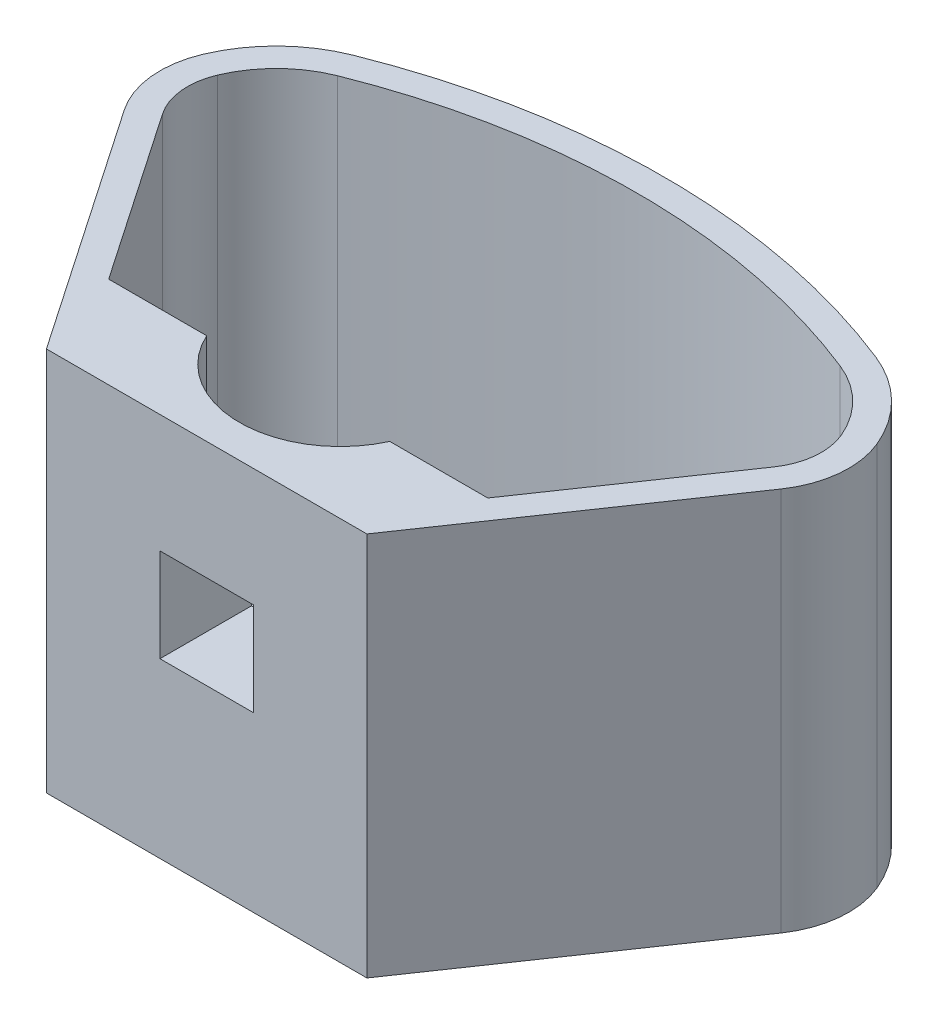
ISO-10303-21;
HEADER;
FILE_DESCRIPTION(('STEP AP214'),'2;1');
FILE_NAME('part.step','',(''),(''),'','','');
FILE_SCHEMA(('AUTOMOTIVE_DESIGN { 1 0 10303 214 1 1 1 1 }'));
ENDSEC;
DATA;
#1=APPLICATION_CONTEXT('core data for automotive mechanical design processes');
#2=APPLICATION_PROTOCOL_DEFINITION('international standard','automotive_design',2000,#1);
#3=PRODUCT_CONTEXT('',#1,'mechanical');
#4=PRODUCT('Part','Part','',(#3));
#5=PRODUCT_RELATED_PRODUCT_CATEGORY('part','',(#4));
#6=PRODUCT_DEFINITION_FORMATION('','',#4);
#7=PRODUCT_DEFINITION_CONTEXT('part definition',#1,'design');
#8=PRODUCT_DEFINITION('design','',#6,#7);
#9=PRODUCT_DEFINITION_SHAPE('','',#8);
#10=(LENGTH_UNIT() NAMED_UNIT(*) SI_UNIT(.MILLI.,.METRE.));
#11=(NAMED_UNIT(*) PLANE_ANGLE_UNIT() SI_UNIT($,.RADIAN.));
#12=(NAMED_UNIT(*) SI_UNIT($,.STERADIAN.) SOLID_ANGLE_UNIT());
#13=UNCERTAINTY_MEASURE_WITH_UNIT(LENGTH_MEASURE(1.E-05),#10,'distance_accuracy_value','');
#14=(GEOMETRIC_REPRESENTATION_CONTEXT(3) GLOBAL_UNCERTAINTY_ASSIGNED_CONTEXT((#13)) GLOBAL_UNIT_ASSIGNED_CONTEXT((#10,
#11,#12)) REPRESENTATION_CONTEXT('',''));
#15=CARTESIAN_POINT('',(0.,0.,0.));
#16=DIRECTION('',(0.,0.,1.));
#17=DIRECTION('',(1.,0.,0.));
#18=AXIS2_PLACEMENT_3D('',#15,#16,#17);
#19=CARTESIAN_POINT('',(0.,42.,27.2));
#20=DIRECTION('',(0.,-1.,0.));
#21=DIRECTION('',(0.,0.,-1.));
#22=AXIS2_PLACEMENT_3D('',#19,#20,#21);
#23=PLANE('',#22);
#24=DIRECTION('',(0.564190505025556,0.,-0.825644641500814));
#25=VECTOR('',#24,1.);
#26=CARTESIAN_POINT('',(17.5,42.,0.));
#27=LINE('',#26,#25);
#28=CARTESIAN_POINT('',(17.5,42.,0.));
#29=VERTEX_POINT('',#28);
#30=CARTESIAN_POINT('',(35.8684387410676,42.,-26.880642060099));
#31=VERTEX_POINT('',#30);
#32=EDGE_CURVE('E300',#29,#31,#27,.T.);
#33=ORIENTED_EDGE('',*,*,#32,.T.);
#34=CARTESIAN_POINT('',(27.6119923260595,42.,-32.5225471103545));
#35=DIRECTION('',(0.,-1.,0.));
#36=DIRECTION('',(0.,0.,-1.));
#37=AXIS2_PLACEMENT_3D('',#34,#35,#36);
#38=CIRCLE('',#37,10.);
#39=CARTESIAN_POINT('',(36.8359769781785,42.,-36.384943663982));
#40=VERTEX_POINT('',#39);
#41=EDGE_CURVE('E346',#31,#40,#38,.F.);
#42=ORIENTED_EDGE('',*,*,#41,.T.);
#43=CARTESIAN_POINT('',(23.,42.,-30.5913488335408));
#44=DIRECTION('',(0.,-1.,0.));
#45=DIRECTION('',(0.,0.,-1.));
#46=AXIS2_PLACEMENT_3D('',#43,#44,#45);
#47=CIRCLE('',#46,15.);
#48=CARTESIAN_POINT('',(28.5466237942122,42.,-44.5281692917902));
#49=VERTEX_POINT('',#48);
#50=EDGE_CURVE('E333',#40,#49,#47,.F.);
#51=ORIENTED_EDGE('',*,*,#50,.T.);
#52=CARTESIAN_POINT('',(0.,42.,27.2));
#53=DIRECTION('',(0.,1.,0.));
#54=DIRECTION('',(0.,0.,-1.));
#55=AXIS2_PLACEMENT_3D('',#52,#53,#54);
#56=CIRCLE('',#55,77.2);
#57=CARTESIAN_POINT('',(-28.5466237942122,42.,-44.5281692917902));
#58=VERTEX_POINT('',#57);
#59=EDGE_CURVE('E303',#49,#58,#56,.T.);
#60=ORIENTED_EDGE('',*,*,#59,.T.);
#61=CARTESIAN_POINT('',(-23.,42.,-30.5913488335408));
#62=DIRECTION('',(0.,-1.,0.));
#63=DIRECTION('',(0.,0.,-1.));
#64=AXIS2_PLACEMENT_3D('',#61,#62,#63);
#65=CIRCLE('',#64,15.);
#66=CARTESIAN_POINT('',(-36.8359769781785,42.,-36.384943663982));
#67=VERTEX_POINT('',#66);
#68=EDGE_CURVE('E330',#58,#67,#65,.F.);
#69=ORIENTED_EDGE('',*,*,#68,.T.);
#70=CARTESIAN_POINT('',(-27.6119923260595,42.,-32.5225471103545));
#71=DIRECTION('',(0.,-1.,0.));
#72=DIRECTION('',(0.,0.,-1.));
#73=AXIS2_PLACEMENT_3D('',#70,#71,#72);
#74=CIRCLE('',#73,10.);
#75=CARTESIAN_POINT('',(-35.8684387410676,42.,-26.880642060099));
#76=VERTEX_POINT('',#75);
#77=EDGE_CURVE('E344',#67,#76,#74,.F.);
#78=ORIENTED_EDGE('',*,*,#77,.T.);
#79=DIRECTION('',(0.564190505025556,0.,0.825644641500814));
#80=VECTOR('',#79,1.);
#81=CARTESIAN_POINT('',(-38.,42.,-30.));
#82=LINE('',#81,#80);
#83=CARTESIAN_POINT('',(-17.5,42.,0.));
#84=VERTEX_POINT('',#83);
#85=EDGE_CURVE('E295',#76,#84,#82,.T.);
#86=ORIENTED_EDGE('',*,*,#85,.T.);
#87=DIRECTION('',(1.,0.,0.));
#88=VECTOR('',#87,1.);
#89=CARTESIAN_POINT('',(17.5,42.,0.));
#90=LINE('',#89,#88);
#91=EDGE_CURVE('E297',#84,#29,#90,.T.);
#92=ORIENTED_EDGE('',*,*,#91,.T.);
#93=EDGE_LOOP('',(#33,#42,#51,#60,#69,#78,#86,#92));
#94=FACE_BOUND('',#93,.T.);
#95=DIRECTION('',(-1.,0.,0.));
#96=VECTOR('',#95,1.);
#97=CARTESIAN_POINT('',(-20.6998088735285,42.,-10.));
#98=LINE('',#97,#96);
#99=CARTESIAN_POINT('',(20.6998088735285,42.,-10.));
#100=VERTEX_POINT('',#99);
#101=CARTESIAN_POINT('',(10.,42.,-10.));
#102=VERTEX_POINT('',#101);
#103=EDGE_CURVE('E233',#100,#102,#98,.T.);
#104=ORIENTED_EDGE('',*,*,#103,.T.);
#105=CARTESIAN_POINT('',(0.,42.,-14.5825756949558));
#106=DIRECTION('',(0.,1.,0.));
#107=DIRECTION('',(0.,0.,1.));
#108=AXIS2_PLACEMENT_3D('',#105,#106,#107);
#109=CIRCLE('',#108,11.);
#110=CARTESIAN_POINT('',(-10.,42.,-10.));
#111=VERTEX_POINT('',#110);
#112=EDGE_CURVE('E189',#111,#102,#109,.T.);
#113=ORIENTED_EDGE('',*,*,#112,.F.);
#114=CARTESIAN_POINT('',(-20.6998088735285,42.,-10.));
#115=VERTEX_POINT('',#114);
#116=EDGE_CURVE('E198',#111,#115,#98,.T.);
#117=ORIENTED_EDGE('',*,*,#116,.T.);
#118=DIRECTION('',(0.564190505025556,0.,0.825644641500814));
#119=VECTOR('',#118,1.);
#120=CARTESIAN_POINT('',(3.21770271829148,42.,25.0012364758341));
#121=LINE('',#120,#119);
#122=CARTESIAN_POINT('',(-33.3915048165652,42.,-28.5732135751756));
#123=VERTEX_POINT('',#122);
#124=EDGE_CURVE('E273',#123,#115,#121,.T.);
#125=ORIENTED_EDGE('',*,*,#124,.F.);
#126=CARTESIAN_POINT('',(-27.6119923260595,42.,-32.5225471103545));
#127=DIRECTION('',(0.,-1.,0.));
#128=DIRECTION('',(0.,0.,-1.));
#129=AXIS2_PLACEMENT_3D('',#126,#127,#128);
#130=CIRCLE('',#129,7.);
#131=CARTESIAN_POINT('',(-34.0687815825428,42.,-35.2262246978937));
#132=VERTEX_POINT('',#131);
#133=EDGE_CURVE('E257',#132,#123,#130,.F.);
#134=ORIENTED_EDGE('',*,*,#133,.F.);
#135=CARTESIAN_POINT('',(-23.,42.,-30.5913488335408));
#136=DIRECTION('',(0.,-1.,0.));
#137=DIRECTION('',(0.,0.,-1.));
#138=AXIS2_PLACEMENT_3D('',#135,#136,#137);
#139=CIRCLE('',#138,12.);
#140=CARTESIAN_POINT('',(-27.4372990353698,42.,-41.7408052001403));
#141=VERTEX_POINT('',#140);
#142=EDGE_CURVE('E262',#141,#132,#139,.F.);
#143=ORIENTED_EDGE('',*,*,#142,.F.);
#144=CARTESIAN_POINT('',(0.,42.,27.2));
#145=DIRECTION('',(0.,-1.,0.));
#146=DIRECTION('',(0.,0.,-1.));
#147=AXIS2_PLACEMENT_3D('',#144,#145,#146);
#148=CIRCLE('',#147,74.2);
#149=CARTESIAN_POINT('',(27.4372990353698,42.,-41.7408052001403));
#150=VERTEX_POINT('',#149);
#151=EDGE_CURVE('E278',#150,#141,#148,.F.);
#152=ORIENTED_EDGE('',*,*,#151,.F.);
#153=CARTESIAN_POINT('',(23.,42.,-30.5913488335408));
#154=DIRECTION('',(0.,-1.,0.));
#155=DIRECTION('',(0.,0.,-1.));
#156=AXIS2_PLACEMENT_3D('',#153,#154,#155);
#157=CIRCLE('',#156,12.);
#158=CARTESIAN_POINT('',(34.0687815825428,42.,-35.2262246978938));
#159=VERTEX_POINT('',#158);
#160=EDGE_CURVE('E281',#159,#150,#157,.F.);
#161=ORIENTED_EDGE('',*,*,#160,.F.);
#162=CARTESIAN_POINT('',(27.6119923260595,42.,-32.5225471103545));
#163=DIRECTION('',(0.,-1.,0.));
#164=DIRECTION('',(0.,0.,-1.));
#165=AXIS2_PLACEMENT_3D('',#162,#163,#164);
#166=CIRCLE('',#165,7.);
#167=CARTESIAN_POINT('',(33.3915048165652,42.,-28.5732135751756));
#168=VERTEX_POINT('',#167);
#169=EDGE_CURVE('E248',#168,#159,#166,.F.);
#170=ORIENTED_EDGE('',*,*,#169,.F.);
#171=DIRECTION('',(0.564190505025556,0.,-0.825644641500814));
#172=VECTOR('',#171,1.);
#173=CARTESIAN_POINT('',(-3.21770271829148,42.,25.0012364758341));
#174=LINE('',#173,#172);
#175=EDGE_CURVE('E286',#100,#168,#174,.T.);
#176=ORIENTED_EDGE('',*,*,#175,.F.);
#177=EDGE_LOOP('',(#104,#113,#117,#125,#134,#143,#152,#161,#170,#176));
#178=FACE_BOUND('',#177,.T.);
#179=ADVANCED_FACE('F34',(#94,#178),#23,.F.);
#180=CARTESIAN_POINT('',(-38.,42.,-30.));
#181=DIRECTION('',(0.825644641500814,0.,-0.564190505025556));
#182=DIRECTION('',(-0.564190505025556,0.,-0.825644641500814));
#183=AXIS2_PLACEMENT_3D('',#180,#181,#182);
#184=PLANE('',#183);
#185=ORIENTED_EDGE('',*,*,#85,.F.);
#186=DIRECTION('',(0.,1.,0.));
#187=VECTOR('',#186,1.);
#188=CARTESIAN_POINT('',(-35.8684387410676,0.,-26.880642060099));
#189=LINE('',#188,#187);
#190=CARTESIAN_POINT('',(-35.8684387410676,0.,-26.880642060099));
#191=VERTEX_POINT('',#190);
#192=EDGE_CURVE('E42',#76,#191,#189,.F.);
#193=ORIENTED_EDGE('',*,*,#192,.T.);
#194=DIRECTION('',(0.564190505025556,0.,0.825644641500814));
#195=VECTOR('',#194,1.);
#196=CARTESIAN_POINT('',(-38.,0.,-30.));
#197=LINE('',#196,#195);
#198=CARTESIAN_POINT('',(-17.5,0.,0.));
#199=VERTEX_POINT('',#198);
#200=EDGE_CURVE('E283',#191,#199,#197,.T.);
#201=ORIENTED_EDGE('',*,*,#200,.T.);
#202=DIRECTION('',(0.,-1.,0.));
#203=VECTOR('',#202,1.);
#204=CARTESIAN_POINT('',(-17.5,42.,0.));
#205=LINE('',#204,#203);
#206=EDGE_CURVE('E317',#84,#199,#205,.T.);
#207=ORIENTED_EDGE('',*,*,#206,.F.);
#208=EDGE_LOOP('',(#185,#193,#201,#207));
#209=FACE_BOUND('',#208,.T.);
#210=ADVANCED_FACE('F352',(#209),#184,.F.);
#211=CARTESIAN_POINT('',(17.5,42.,0.));
#212=DIRECTION('',(0.,0.,-1.));
#213=DIRECTION('',(-1.,0.,0.));
#214=AXIS2_PLACEMENT_3D('',#211,#212,#213);
#215=PLANE('',#214);
#216=DIRECTION('',(0.,1.,0.));
#217=VECTOR('',#216,1.);
#218=CARTESIAN_POINT('',(5.1,18.9,0.));
#219=LINE('',#218,#217);
#220=CARTESIAN_POINT('',(5.1,18.9,0.));
#221=VERTEX_POINT('',#220);
#222=CARTESIAN_POINT('',(5.1,29.1,0.));
#223=VERTEX_POINT('',#222);
#224=EDGE_CURVE('E218',#221,#223,#219,.T.);
#225=ORIENTED_EDGE('',*,*,#224,.F.);
#226=DIRECTION('',(1.,0.,0.));
#227=VECTOR('',#226,1.);
#228=CARTESIAN_POINT('',(5.1,18.9,0.));
#229=LINE('',#228,#227);
#230=CARTESIAN_POINT('',(-5.09999999999999,18.9,0.));
#231=VERTEX_POINT('',#230);
#232=EDGE_CURVE('E215',#231,#221,#229,.T.);
#233=ORIENTED_EDGE('',*,*,#232,.F.);
#234=DIRECTION('',(0.,-1.,0.));
#235=VECTOR('',#234,1.);
#236=CARTESIAN_POINT('',(-5.09999999999999,18.9,0.));
#237=LINE('',#236,#235);
#238=CARTESIAN_POINT('',(-5.09999999999999,29.1,0.));
#239=VERTEX_POINT('',#238);
#240=EDGE_CURVE('E212',#239,#231,#237,.T.);
#241=ORIENTED_EDGE('',*,*,#240,.F.);
#242=DIRECTION('',(-1.,0.,0.));
#243=VECTOR('',#242,1.);
#244=CARTESIAN_POINT('',(5.1,29.1,0.));
#245=LINE('',#244,#243);
#246=EDGE_CURVE('E56',#223,#239,#245,.T.);
#247=ORIENTED_EDGE('',*,*,#246,.F.);
#248=EDGE_LOOP('',(#225,#233,#241,#247));
#249=FACE_BOUND('',#248,.T.);
#250=DIRECTION('',(1.,0.,0.));
#251=VECTOR('',#250,1.);
#252=CARTESIAN_POINT('',(17.5,0.,0.));
#253=LINE('',#252,#251);
#254=CARTESIAN_POINT('',(17.5,0.,0.));
#255=VERTEX_POINT('',#254);
#256=EDGE_CURVE('E308',#199,#255,#253,.T.);
#257=ORIENTED_EDGE('',*,*,#256,.T.);
#258=DIRECTION('',(0.,-1.,0.));
#259=VECTOR('',#258,1.);
#260=CARTESIAN_POINT('',(17.5,42.,0.));
#261=LINE('',#260,#259);
#262=EDGE_CURVE('E306',#29,#255,#261,.T.);
#263=ORIENTED_EDGE('',*,*,#262,.F.);
#264=ORIENTED_EDGE('',*,*,#91,.F.);
#265=ORIENTED_EDGE('',*,*,#206,.T.);
#266=EDGE_LOOP('',(#257,#263,#264,#265));
#267=FACE_BOUND('',#266,.T.);
#268=ADVANCED_FACE('F364',(#249,#267),#215,.F.);
#269=CARTESIAN_POINT('',(17.5,42.,0.));
#270=DIRECTION('',(-0.825644641500814,0.,-0.564190505025556));
#271=DIRECTION('',(-0.564190505025556,0.,0.825644641500814));
#272=AXIS2_PLACEMENT_3D('',#269,#270,#271);
#273=PLANE('',#272);
#274=DIRECTION('',(0.564190505025556,0.,-0.825644641500814));
#275=VECTOR('',#274,1.);
#276=CARTESIAN_POINT('',(17.5,0.,0.));
#277=LINE('',#276,#275);
#278=CARTESIAN_POINT('',(35.8684387410676,0.,-26.880642060099));
#279=VERTEX_POINT('',#278);
#280=EDGE_CURVE('E310',#255,#279,#277,.T.);
#281=ORIENTED_EDGE('',*,*,#280,.T.);
#282=DIRECTION('',(0.,1.,0.));
#283=VECTOR('',#282,1.);
#284=CARTESIAN_POINT('',(35.8684387410676,42.,-26.880642060099));
#285=LINE('',#284,#283);
#286=EDGE_CURVE('E342',#279,#31,#285,.T.);
#287=ORIENTED_EDGE('',*,*,#286,.T.);
#288=ORIENTED_EDGE('',*,*,#32,.F.);
#289=ORIENTED_EDGE('',*,*,#262,.T.);
#290=EDGE_LOOP('',(#281,#287,#288,#289));
#291=FACE_BOUND('',#290,.T.);
#292=ADVANCED_FACE('F386',(#291),#273,.F.);
#293=CARTESIAN_POINT('',(0.,42.,27.2));
#294=DIRECTION('',(0.,-1.,0.));
#295=DIRECTION('',(0.,0.,-1.));
#296=AXIS2_PLACEMENT_3D('',#293,#294,#295);
#297=CYLINDRICAL_SURFACE('',#296,77.2);
#298=ORIENTED_EDGE('',*,*,#59,.F.);
#299=DIRECTION('',(0.,-1.,0.));
#300=VECTOR('',#299,1.);
#301=CARTESIAN_POINT('',(28.5466237942122,42.,-44.5281692917902));
#302=LINE('',#301,#300);
#303=CARTESIAN_POINT('',(28.5466237942122,0.,-44.5281692917902));
#304=VERTEX_POINT('',#303);
#305=EDGE_CURVE('E322',#49,#304,#302,.T.);
#306=ORIENTED_EDGE('',*,*,#305,.T.);
#307=CARTESIAN_POINT('',(0.,0.,27.2));
#308=DIRECTION('',(0.,1.,0.));
#309=DIRECTION('',(0.,0.,-1.));
#310=AXIS2_PLACEMENT_3D('',#307,#308,#309);
#311=CIRCLE('',#310,77.2);
#312=CARTESIAN_POINT('',(-28.5466237942122,0.,-44.5281692917902));
#313=VERTEX_POINT('',#312);
#314=EDGE_CURVE('E298',#304,#313,#311,.T.);
#315=ORIENTED_EDGE('',*,*,#314,.T.);
#316=DIRECTION('',(0.,-1.,0.));
#317=VECTOR('',#316,1.);
#318=CARTESIAN_POINT('',(-28.5466237942122,42.,-44.5281692917902));
#319=LINE('',#318,#317);
#320=EDGE_CURVE('E320',#313,#58,#319,.F.);
#321=ORIENTED_EDGE('',*,*,#320,.T.);
#322=EDGE_LOOP('',(#298,#306,#315,#321));
#323=FACE_BOUND('',#322,.T.);
#324=ADVANCED_FACE('F377',(#323),#297,.T.);
#325=CARTESIAN_POINT('',(0.,0.,27.2));
#326=DIRECTION('',(0.,-1.,0.));
#327=DIRECTION('',(0.,0.,-1.));
#328=AXIS2_PLACEMENT_3D('',#325,#326,#327);
#329=PLANE('',#328);
#330=CARTESIAN_POINT('',(23.,0.,-30.5913488335408));
#331=DIRECTION('',(0.,-1.,0.));
#332=DIRECTION('',(0.,0.,-1.));
#333=AXIS2_PLACEMENT_3D('',#330,#331,#332);
#334=CIRCLE('',#333,15.);
#335=CARTESIAN_POINT('',(36.8359769781785,0.,-36.384943663982));
#336=VERTEX_POINT('',#335);
#337=EDGE_CURVE('E327',#304,#336,#334,.T.);
#338=ORIENTED_EDGE('',*,*,#337,.T.);
#339=CARTESIAN_POINT('',(27.6119923260595,0.,-32.5225471103545));
#340=DIRECTION('',(0.,-1.,0.));
#341=DIRECTION('',(0.,0.,-1.));
#342=AXIS2_PLACEMENT_3D('',#339,#340,#341);
#343=CIRCLE('',#342,10.);
#344=EDGE_CURVE('E340',#336,#279,#343,.T.);
#345=ORIENTED_EDGE('',*,*,#344,.T.);
#346=ORIENTED_EDGE('',*,*,#280,.F.);
#347=ORIENTED_EDGE('',*,*,#256,.F.);
#348=ORIENTED_EDGE('',*,*,#200,.F.);
#349=CARTESIAN_POINT('',(-27.6119923260595,0.,-32.5225471103545));
#350=DIRECTION('',(0.,-1.,0.));
#351=DIRECTION('',(0.,0.,-1.));
#352=AXIS2_PLACEMENT_3D('',#349,#350,#351);
#353=CIRCLE('',#352,10.);
#354=CARTESIAN_POINT('',(-36.8359769781785,0.,-36.384943663982));
#355=VERTEX_POINT('',#354);
#356=EDGE_CURVE('E338',#191,#355,#353,.T.);
#357=ORIENTED_EDGE('',*,*,#356,.T.);
#358=CARTESIAN_POINT('',(-23.,0.,-30.5913488335408));
#359=DIRECTION('',(0.,-1.,0.));
#360=DIRECTION('',(0.,0.,-1.));
#361=AXIS2_PLACEMENT_3D('',#358,#359,#360);
#362=CIRCLE('',#361,15.);
#363=EDGE_CURVE('E325',#355,#313,#362,.T.);
#364=ORIENTED_EDGE('',*,*,#363,.T.);
#365=ORIENTED_EDGE('',*,*,#314,.F.);
#366=EDGE_LOOP('',(#338,#345,#346,#347,#348,#357,#364,#365));
#367=FACE_BOUND('',#366,.T.);
#368=ADVANCED_FACE('F358',(#367),#329,.T.);
#369=CARTESIAN_POINT('',(23.,42.,-30.5913488335408));
#370=DIRECTION('',(0.,-1.,0.));
#371=DIRECTION('',(0.,0.,-1.));
#372=AXIS2_PLACEMENT_3D('',#369,#370,#371);
#373=CYLINDRICAL_SURFACE('',#372,15.);
#374=ORIENTED_EDGE('',*,*,#50,.F.);
#375=DIRECTION('',(0.,-1.,0.));
#376=VECTOR('',#375,1.);
#377=CARTESIAN_POINT('',(36.8359769781785,42.,-36.384943663982));
#378=LINE('',#377,#376);
#379=EDGE_CURVE('E335',#40,#336,#378,.T.);
#380=ORIENTED_EDGE('',*,*,#379,.T.);
#381=ORIENTED_EDGE('',*,*,#337,.F.);
#382=ORIENTED_EDGE('',*,*,#305,.F.);
#383=EDGE_LOOP('',(#374,#380,#381,#382));
#384=FACE_BOUND('',#383,.T.);
#385=ADVANCED_FACE('F381',(#384),#373,.T.);
#386=CARTESIAN_POINT('',(-23.,42.,-30.5913488335408));
#387=DIRECTION('',(0.,-1.,0.));
#388=DIRECTION('',(0.,0.,-1.));
#389=AXIS2_PLACEMENT_3D('',#386,#387,#388);
#390=CYLINDRICAL_SURFACE('',#389,15.);
#391=ORIENTED_EDGE('',*,*,#363,.F.);
#392=DIRECTION('',(0.,-1.,0.));
#393=VECTOR('',#392,1.);
#394=CARTESIAN_POINT('',(-36.8359769781785,42.,-36.384943663982));
#395=LINE('',#394,#393);
#396=EDGE_CURVE('E11',#355,#67,#395,.F.);
#397=ORIENTED_EDGE('',*,*,#396,.T.);
#398=ORIENTED_EDGE('',*,*,#68,.F.);
#399=ORIENTED_EDGE('',*,*,#320,.F.);
#400=EDGE_LOOP('',(#391,#397,#398,#399));
#401=FACE_BOUND('',#400,.T.);
#402=ADVANCED_FACE('F372',(#401),#390,.T.);
#403=CARTESIAN_POINT('',(27.6119923260595,42.,-32.5225471103545));
#404=DIRECTION('',(0.,-1.,0.));
#405=DIRECTION('',(0.,0.,-1.));
#406=AXIS2_PLACEMENT_3D('',#403,#404,#405);
#407=CYLINDRICAL_SURFACE('',#406,10.);
#408=ORIENTED_EDGE('',*,*,#41,.F.);
#409=ORIENTED_EDGE('',*,*,#286,.F.);
#410=ORIENTED_EDGE('',*,*,#344,.F.);
#411=ORIENTED_EDGE('',*,*,#379,.F.);
#412=EDGE_LOOP('',(#408,#409,#410,#411));
#413=FACE_BOUND('',#412,.T.);
#414=ADVANCED_FACE('F387',(#413),#407,.T.);
#415=CARTESIAN_POINT('',(-27.6119923260595,42.,-32.5225471103545));
#416=DIRECTION('',(0.,-1.,0.));
#417=DIRECTION('',(0.,0.,-1.));
#418=AXIS2_PLACEMENT_3D('',#415,#416,#417);
#419=CYLINDRICAL_SURFACE('',#418,10.);
#420=ORIENTED_EDGE('',*,*,#77,.F.);
#421=ORIENTED_EDGE('',*,*,#396,.F.);
#422=ORIENTED_EDGE('',*,*,#356,.F.);
#423=ORIENTED_EDGE('',*,*,#192,.F.);
#424=EDGE_LOOP('',(#420,#421,#422,#423));
#425=FACE_BOUND('',#424,.T.);
#426=ADVANCED_FACE('F36',(#425),#419,.T.);
#427=CARTESIAN_POINT('',(-35.5230660754976,42.,-31.6925715150767));
#428=DIRECTION('',(0.825644641500814,0.,-0.564190505025556));
#429=DIRECTION('',(-0.564190505025556,0.,-0.825644641500814));
#430=AXIS2_PLACEMENT_3D('',#427,#428,#429);
#431=PLANE('',#430);
#432=DIRECTION('',(0.,1.,0.));
#433=VECTOR('',#432,1.);
#434=CARTESIAN_POINT('',(-20.6998088735285,-38.987240318964,-10.));
#435=LINE('',#434,#433);
#436=CARTESIAN_POINT('',(-20.6998088735285,3.,-10.));
#437=VERTEX_POINT('',#436);
#438=EDGE_CURVE('E239',#437,#115,#435,.T.);
#439=ORIENTED_EDGE('',*,*,#438,.F.);
#440=DIRECTION('',(0.564190505025556,0.,0.825644641500814));
#441=VECTOR('',#440,1.);
#442=CARTESIAN_POINT('',(3.21770271829148,3.,25.0012364758341));
#443=LINE('',#442,#441);
#444=CARTESIAN_POINT('',(-33.3915048165652,3.,-28.5732135751756));
#445=VERTEX_POINT('',#444);
#446=EDGE_CURVE('E241',#445,#437,#443,.T.);
#447=ORIENTED_EDGE('',*,*,#446,.F.);
#448=DIRECTION('',(0.,1.,0.));
#449=VECTOR('',#448,1.);
#450=CARTESIAN_POINT('',(-33.3915048165652,42.,-28.5732135751756));
#451=LINE('',#450,#449);
#452=EDGE_CURVE('E244',#123,#445,#451,.F.);
#453=ORIENTED_EDGE('',*,*,#452,.F.);
#454=ORIENTED_EDGE('',*,*,#124,.T.);
#455=EDGE_LOOP('',(#439,#447,#453,#454));
#456=FACE_BOUND('',#455,.T.);
#457=ADVANCED_FACE('F393',(#456),#431,.T.);
#458=CARTESIAN_POINT('',(15.0230660754976,42.,-1.69257151507667));
#459=DIRECTION('',(-0.825644641500814,0.,-0.564190505025556));
#460=DIRECTION('',(-0.564190505025556,0.,0.825644641500814));
#461=AXIS2_PLACEMENT_3D('',#458,#459,#460);
#462=PLANE('',#461);
#463=DIRECTION('',(0.,1.,0.));
#464=VECTOR('',#463,1.);
#465=CARTESIAN_POINT('',(20.6998088735285,-38.987240318964,-10.));
#466=LINE('',#465,#464);
#467=CARTESIAN_POINT('',(20.6998088735285,3.,-9.99999999999999));
#468=VERTEX_POINT('',#467);
#469=EDGE_CURVE('E236',#468,#100,#466,.T.);
#470=ORIENTED_EDGE('',*,*,#469,.T.);
#471=ORIENTED_EDGE('',*,*,#175,.T.);
#472=DIRECTION('',(0.,1.,0.));
#473=VECTOR('',#472,1.);
#474=CARTESIAN_POINT('',(33.3915048165652,42.,-28.5732135751756));
#475=LINE('',#474,#473);
#476=CARTESIAN_POINT('',(33.3915048165652,3.,-28.5732135751756));
#477=VERTEX_POINT('',#476);
#478=EDGE_CURVE('E254',#477,#168,#475,.T.);
#479=ORIENTED_EDGE('',*,*,#478,.F.);
#480=DIRECTION('',(0.564190505025556,0.,-0.825644641500814));
#481=VECTOR('',#480,1.);
#482=CARTESIAN_POINT('',(-3.21770271829148,3.,25.0012364758341));
#483=LINE('',#482,#481);
#484=EDGE_CURVE('E251',#468,#477,#483,.T.);
#485=ORIENTED_EDGE('',*,*,#484,.F.);
#486=EDGE_LOOP('',(#470,#471,#479,#485));
#487=FACE_BOUND('',#486,.T.);
#488=ADVANCED_FACE('F446',(#487),#462,.T.);
#489=CARTESIAN_POINT('',(0.,42.,27.2));
#490=DIRECTION('',(0.,-1.,0.));
#491=DIRECTION('',(0.,0.,-1.));
#492=AXIS2_PLACEMENT_3D('',#489,#490,#491);
#493=CYLINDRICAL_SURFACE('',#492,74.2);
#494=ORIENTED_EDGE('',*,*,#151,.T.);
#495=DIRECTION('',(0.,-1.,0.));
#496=VECTOR('',#495,1.);
#497=CARTESIAN_POINT('',(-27.4372990353698,42.,-41.7408052001403));
#498=LINE('',#497,#496);
#499=CARTESIAN_POINT('',(-27.4372990353698,3.,-41.7408052001403));
#500=VERTEX_POINT('',#499);
#501=EDGE_CURVE('E276',#500,#141,#498,.F.);
#502=ORIENTED_EDGE('',*,*,#501,.F.);
#503=CARTESIAN_POINT('',(0.,3.,27.2));
#504=DIRECTION('',(0.,-1.,0.));
#505=DIRECTION('',(0.,0.,-1.));
#506=AXIS2_PLACEMENT_3D('',#503,#504,#505);
#507=CIRCLE('',#506,74.2);
#508=CARTESIAN_POINT('',(27.4372990353698,3.,-41.7408052001403));
#509=VERTEX_POINT('',#508);
#510=EDGE_CURVE('E253',#509,#500,#507,.F.);
#511=ORIENTED_EDGE('',*,*,#510,.F.);
#512=DIRECTION('',(0.,-1.,0.));
#513=VECTOR('',#512,1.);
#514=CARTESIAN_POINT('',(27.4372990353698,42.,-41.7408052001403));
#515=LINE('',#514,#513);
#516=EDGE_CURVE('E270',#150,#509,#515,.T.);
#517=ORIENTED_EDGE('',*,*,#516,.F.);
#518=EDGE_LOOP('',(#494,#502,#511,#517));
#519=FACE_BOUND('',#518,.T.);
#520=ADVANCED_FACE('F440',(#519),#493,.F.);
#521=CARTESIAN_POINT('',(0.,3.,27.2));
#522=DIRECTION('',(0.,-1.,0.));
#523=DIRECTION('',(0.,0.,-1.));
#524=AXIS2_PLACEMENT_3D('',#521,#522,#523);
#525=PLANE('',#524);
#526=ORIENTED_EDGE('',*,*,#446,.T.);
#527=DIRECTION('',(-1.,0.,0.));
#528=VECTOR('',#527,1.);
#529=CARTESIAN_POINT('',(-20.6998088735285,3.,-10.));
#530=LINE('',#529,#528);
#531=EDGE_CURVE('E237',#468,#437,#530,.T.);
#532=ORIENTED_EDGE('',*,*,#531,.F.);
#533=ORIENTED_EDGE('',*,*,#484,.T.);
#534=CARTESIAN_POINT('',(27.6119923260595,3.,-32.5225471103545));
#535=DIRECTION('',(0.,-1.,0.));
#536=DIRECTION('',(0.,0.,-1.));
#537=AXIS2_PLACEMENT_3D('',#534,#535,#536);
#538=CIRCLE('',#537,7.);
#539=CARTESIAN_POINT('',(34.0687815825428,3.,-35.2262246978938));
#540=VERTEX_POINT('',#539);
#541=EDGE_CURVE('E258',#540,#477,#538,.T.);
#542=ORIENTED_EDGE('',*,*,#541,.F.);
#543=CARTESIAN_POINT('',(23.,3.,-30.5913488335408));
#544=DIRECTION('',(0.,-1.,0.));
#545=DIRECTION('',(0.,0.,-1.));
#546=AXIS2_PLACEMENT_3D('',#543,#544,#545);
#547=CIRCLE('',#546,12.);
#548=EDGE_CURVE('E259',#509,#540,#547,.T.);
#549=ORIENTED_EDGE('',*,*,#548,.F.);
#550=ORIENTED_EDGE('',*,*,#510,.T.);
#551=CARTESIAN_POINT('',(-23.,3.,-30.5913488335408));
#552=DIRECTION('',(0.,-1.,0.));
#553=DIRECTION('',(0.,0.,-1.));
#554=AXIS2_PLACEMENT_3D('',#551,#552,#553);
#555=CIRCLE('',#554,12.);
#556=CARTESIAN_POINT('',(-34.0687815825428,3.,-35.2262246978937));
#557=VERTEX_POINT('',#556);
#558=EDGE_CURVE('E263',#557,#500,#555,.T.);
#559=ORIENTED_EDGE('',*,*,#558,.F.);
#560=CARTESIAN_POINT('',(-27.6119923260595,3.,-32.5225471103545));
#561=DIRECTION('',(0.,-1.,0.));
#562=DIRECTION('',(0.,0.,-1.));
#563=AXIS2_PLACEMENT_3D('',#560,#561,#562);
#564=CIRCLE('',#563,7.);
#565=EDGE_CURVE('E266',#445,#557,#564,.T.);
#566=ORIENTED_EDGE('',*,*,#565,.F.);
#567=EDGE_LOOP('',(#526,#532,#533,#542,#549,#550,#559,#566));
#568=FACE_BOUND('',#567,.T.);
#569=ADVANCED_FACE('F445',(#568),#525,.F.);
#570=CARTESIAN_POINT('',(23.,42.,-30.5913488335408));
#571=DIRECTION('',(0.,-1.,0.));
#572=DIRECTION('',(0.,0.,-1.));
#573=AXIS2_PLACEMENT_3D('',#570,#571,#572);
#574=CYLINDRICAL_SURFACE('',#573,12.);
#575=ORIENTED_EDGE('',*,*,#160,.T.);
#576=ORIENTED_EDGE('',*,*,#516,.T.);
#577=ORIENTED_EDGE('',*,*,#548,.T.);
#578=DIRECTION('',(0.,-1.,0.));
#579=VECTOR('',#578,1.);
#580=CARTESIAN_POINT('',(34.0687815825428,42.,-35.2262246978938));
#581=LINE('',#580,#579);
#582=EDGE_CURVE('E268',#159,#540,#581,.T.);
#583=ORIENTED_EDGE('',*,*,#582,.F.);
#584=EDGE_LOOP('',(#575,#576,#577,#583));
#585=FACE_BOUND('',#584,.T.);
#586=ADVANCED_FACE('F456',(#585),#574,.F.);
#587=CARTESIAN_POINT('',(-23.,42.,-30.5913488335408));
#588=DIRECTION('',(0.,-1.,0.));
#589=DIRECTION('',(0.,0.,-1.));
#590=AXIS2_PLACEMENT_3D('',#587,#588,#589);
#591=CYLINDRICAL_SURFACE('',#590,12.);
#592=ORIENTED_EDGE('',*,*,#558,.T.);
#593=ORIENTED_EDGE('',*,*,#501,.T.);
#594=ORIENTED_EDGE('',*,*,#142,.T.);
#595=DIRECTION('',(0.,-1.,0.));
#596=VECTOR('',#595,1.);
#597=CARTESIAN_POINT('',(-34.0687815825428,42.,-35.2262246978937));
#598=LINE('',#597,#596);
#599=EDGE_CURVE('E247',#557,#132,#598,.F.);
#600=ORIENTED_EDGE('',*,*,#599,.F.);
#601=EDGE_LOOP('',(#592,#593,#594,#600));
#602=FACE_BOUND('',#601,.T.);
#603=ADVANCED_FACE('F461',(#602),#591,.F.);
#604=CARTESIAN_POINT('',(27.6119923260595,42.,-32.5225471103545));
#605=DIRECTION('',(0.,-1.,0.));
#606=DIRECTION('',(0.,0.,-1.));
#607=AXIS2_PLACEMENT_3D('',#604,#605,#606);
#608=CYLINDRICAL_SURFACE('',#607,7.);
#609=ORIENTED_EDGE('',*,*,#169,.T.);
#610=ORIENTED_EDGE('',*,*,#582,.T.);
#611=ORIENTED_EDGE('',*,*,#541,.T.);
#612=ORIENTED_EDGE('',*,*,#478,.T.);
#613=EDGE_LOOP('',(#609,#610,#611,#612));
#614=FACE_BOUND('',#613,.T.);
#615=ADVANCED_FACE('F471',(#614),#608,.F.);
#616=CARTESIAN_POINT('',(-27.6119923260595,42.,-32.5225471103545));
#617=DIRECTION('',(0.,-1.,0.));
#618=DIRECTION('',(0.,0.,-1.));
#619=AXIS2_PLACEMENT_3D('',#616,#617,#618);
#620=CYLINDRICAL_SURFACE('',#619,7.);
#621=ORIENTED_EDGE('',*,*,#133,.T.);
#622=ORIENTED_EDGE('',*,*,#452,.T.);
#623=ORIENTED_EDGE('',*,*,#565,.T.);
#624=ORIENTED_EDGE('',*,*,#599,.T.);
#625=EDGE_LOOP('',(#621,#622,#623,#624));
#626=FACE_BOUND('',#625,.T.);
#627=ADVANCED_FACE('F403',(#626),#620,.F.);
#628=CARTESIAN_POINT('',(-20.6998088735285,-38.987240318964,-10.));
#629=DIRECTION('',(0.,0.,-1.));
#630=DIRECTION('',(-1.,0.,0.));
#631=AXIS2_PLACEMENT_3D('',#628,#629,#630);
#632=PLANE('',#631);
#633=DIRECTION('',(0.,1.,0.));
#634=VECTOR('',#633,1.);
#635=CARTESIAN_POINT('',(-10.,32.,-10.));
#636=LINE('',#635,#634);
#637=CARTESIAN_POINT('',(-10.,32.,-10.));
#638=VERTEX_POINT('',#637);
#639=EDGE_CURVE('E183',#638,#111,#636,.T.);
#640=ORIENTED_EDGE('',*,*,#639,.F.);
#641=DIRECTION('',(-1.,0.,0.));
#642=VECTOR('',#641,1.);
#643=CARTESIAN_POINT('',(-10.,32.,-10.));
#644=LINE('',#643,#642);
#645=CARTESIAN_POINT('',(10.,32.,-10.));
#646=VERTEX_POINT('',#645);
#647=EDGE_CURVE('E188',#646,#638,#644,.T.);
#648=ORIENTED_EDGE('',*,*,#647,.F.);
#649=DIRECTION('',(0.,1.,0.));
#650=VECTOR('',#649,1.);
#651=CARTESIAN_POINT('',(10.,32.,-10.));
#652=LINE('',#651,#650);
#653=EDGE_CURVE('E186',#646,#102,#652,.T.);
#654=ORIENTED_EDGE('',*,*,#653,.T.);
#655=ORIENTED_EDGE('',*,*,#103,.F.);
#656=ORIENTED_EDGE('',*,*,#469,.F.);
#657=ORIENTED_EDGE('',*,*,#531,.T.);
#658=ORIENTED_EDGE('',*,*,#438,.T.);
#659=ORIENTED_EDGE('',*,*,#116,.F.);
#660=EDGE_LOOP('',(#640,#648,#654,#655,#656,#657,#658,#659));
#661=FACE_BOUND('',#660,.T.);
#662=DIRECTION('',(1.,0.,0.));
#663=VECTOR('',#662,1.);
#664=CARTESIAN_POINT('',(5.1,18.9,-9.99999999999999));
#665=LINE('',#664,#663);
#666=CARTESIAN_POINT('',(-5.09999999999999,18.9,-10.));
#667=VERTEX_POINT('',#666);
#668=CARTESIAN_POINT('',(5.1,18.9,-9.99999999999999));
#669=VERTEX_POINT('',#668);
#670=EDGE_CURVE('E225',#667,#669,#665,.T.);
#671=ORIENTED_EDGE('',*,*,#670,.T.);
#672=DIRECTION('',(0.,1.,0.));
#673=VECTOR('',#672,1.);
#674=CARTESIAN_POINT('',(5.1,18.9,-9.99999999999999));
#675=LINE('',#674,#673);
#676=CARTESIAN_POINT('',(5.1,29.1,-9.99999999999999));
#677=VERTEX_POINT('',#676);
#678=EDGE_CURVE('E199',#669,#677,#675,.T.);
#679=ORIENTED_EDGE('',*,*,#678,.T.);
#680=DIRECTION('',(-1.,0.,0.));
#681=VECTOR('',#680,1.);
#682=CARTESIAN_POINT('',(5.1,29.1,-9.99999999999999));
#683=LINE('',#682,#681);
#684=CARTESIAN_POINT('',(-5.09999999999999,29.1,-9.99999999999999));
#685=VERTEX_POINT('',#684);
#686=EDGE_CURVE('E202',#677,#685,#683,.T.);
#687=ORIENTED_EDGE('',*,*,#686,.T.);
#688=DIRECTION('',(0.,-1.,0.));
#689=VECTOR('',#688,1.);
#690=CARTESIAN_POINT('',(-5.09999999999999,18.9,-9.99999999999999));
#691=LINE('',#690,#689);
#692=EDGE_CURVE('E209',#685,#667,#691,.T.);
#693=ORIENTED_EDGE('',*,*,#692,.T.);
#694=EDGE_LOOP('',(#671,#679,#687,#693));
#695=FACE_BOUND('',#694,.T.);
#696=ADVANCED_FACE('F195',(#661,#695),#632,.T.);
#697=CARTESIAN_POINT('',(5.1,18.9,-50.001));
#698=DIRECTION('',(0.,-1.,0.));
#699=DIRECTION('',(0.,0.,-1.));
#700=AXIS2_PLACEMENT_3D('',#697,#698,#699);
#701=PLANE('',#700);
#702=DIRECTION('',(0.,0.,1.));
#703=VECTOR('',#702,1.);
#704=CARTESIAN_POINT('',(-5.09999999999999,18.9,-50.001));
#705=LINE('',#704,#703);
#706=EDGE_CURVE('E222',#667,#231,#705,.T.);
#707=ORIENTED_EDGE('',*,*,#706,.T.);
#708=ORIENTED_EDGE('',*,*,#232,.T.);
#709=DIRECTION('',(0.,0.,1.));
#710=VECTOR('',#709,1.);
#711=CARTESIAN_POINT('',(5.1,18.9,-50.001));
#712=LINE('',#711,#710);
#713=EDGE_CURVE('E228',#669,#221,#712,.T.);
#714=ORIENTED_EDGE('',*,*,#713,.F.);
#715=ORIENTED_EDGE('',*,*,#670,.F.);
#716=EDGE_LOOP('',(#707,#708,#714,#715));
#717=FACE_BOUND('',#716,.T.);
#718=ADVANCED_FACE('F525',(#717),#701,.F.);
#719=CARTESIAN_POINT('',(5.1,18.9,-50.001));
#720=DIRECTION('',(1.,0.,0.));
#721=DIRECTION('',(0.,0.,-1.));
#722=AXIS2_PLACEMENT_3D('',#719,#720,#721);
#723=PLANE('',#722);
#724=ORIENTED_EDGE('',*,*,#713,.T.);
#725=ORIENTED_EDGE('',*,*,#224,.T.);
#726=DIRECTION('',(0.,0.,1.));
#727=VECTOR('',#726,1.);
#728=CARTESIAN_POINT('',(5.1,29.1,-50.001));
#729=LINE('',#728,#727);
#730=EDGE_CURVE('E226',#677,#223,#729,.T.);
#731=ORIENTED_EDGE('',*,*,#730,.F.);
#732=ORIENTED_EDGE('',*,*,#678,.F.);
#733=EDGE_LOOP('',(#724,#725,#731,#732));
#734=FACE_BOUND('',#733,.T.);
#735=ADVANCED_FACE('F530',(#734),#723,.F.);
#736=CARTESIAN_POINT('',(5.1,29.1,-50.001));
#737=DIRECTION('',(0.,1.,0.));
#738=DIRECTION('',(0.,0.,1.));
#739=AXIS2_PLACEMENT_3D('',#736,#737,#738);
#740=PLANE('',#739);
#741=ORIENTED_EDGE('',*,*,#730,.T.);
#742=ORIENTED_EDGE('',*,*,#246,.T.);
#743=DIRECTION('',(0.,0.,1.));
#744=VECTOR('',#743,1.);
#745=CARTESIAN_POINT('',(-5.09999999999999,29.1,-50.001));
#746=LINE('',#745,#744);
#747=EDGE_CURVE('E223',#685,#239,#746,.T.);
#748=ORIENTED_EDGE('',*,*,#747,.F.);
#749=ORIENTED_EDGE('',*,*,#686,.F.);
#750=EDGE_LOOP('',(#741,#742,#748,#749));
#751=FACE_BOUND('',#750,.T.);
#752=ADVANCED_FACE('F541',(#751),#740,.F.);
#753=CARTESIAN_POINT('',(-5.09999999999999,18.9,-50.001));
#754=DIRECTION('',(-1.,0.,0.));
#755=DIRECTION('',(0.,0.,1.));
#756=AXIS2_PLACEMENT_3D('',#753,#754,#755);
#757=PLANE('',#756);
#758=ORIENTED_EDGE('',*,*,#747,.T.);
#759=ORIENTED_EDGE('',*,*,#240,.T.);
#760=ORIENTED_EDGE('',*,*,#706,.F.);
#761=ORIENTED_EDGE('',*,*,#692,.F.);
#762=EDGE_LOOP('',(#758,#759,#760,#761));
#763=FACE_BOUND('',#762,.T.);
#764=ADVANCED_FACE('F551',(#763),#757,.F.);
#765=CARTESIAN_POINT('',(0.,32.,-14.5825756949558));
#766=DIRECTION('',(0.,1.,0.));
#767=DIRECTION('',(0.,0.,1.));
#768=AXIS2_PLACEMENT_3D('',#765,#766,#767);
#769=CYLINDRICAL_SURFACE('',#768,11.);
#770=ORIENTED_EDGE('',*,*,#112,.T.);
#771=ORIENTED_EDGE('',*,*,#653,.F.);
#772=CARTESIAN_POINT('',(0.,32.,-14.5825756949558));
#773=DIRECTION('',(0.,1.,0.));
#774=DIRECTION('',(0.,0.,1.));
#775=AXIS2_PLACEMENT_3D('',#772,#773,#774);
#776=CIRCLE('',#775,11.);
#777=EDGE_CURVE('E48',#638,#646,#776,.T.);
#778=ORIENTED_EDGE('',*,*,#777,.F.);
#779=ORIENTED_EDGE('',*,*,#639,.T.);
#780=EDGE_LOOP('',(#770,#771,#778,#779));
#781=FACE_BOUND('',#780,.T.);
#782=ADVANCED_FACE('F181',(#781),#769,.F.);
#783=CARTESIAN_POINT('',(0.,32.,-14.5825756949558));
#784=DIRECTION('',(0.,1.,0.));
#785=DIRECTION('',(0.,0.,1.));
#786=AXIS2_PLACEMENT_3D('',#783,#784,#785);
#787=PLANE('',#786);
#788=ORIENTED_EDGE('',*,*,#777,.T.);
#789=ORIENTED_EDGE('',*,*,#647,.T.);
#790=EDGE_LOOP('',(#788,#789));
#791=FACE_BOUND('',#790,.T.);
#792=ADVANCED_FACE('F191',(#791),#787,.T.);
#793=CLOSED_SHELL('',(#179,#210,#268,#292,#324,#368,#385,#402,#414,#426,#457,#488,#520,#569,
#586,#603,#615,#627,#696,#718,#735,#752,#764,#782,#792));
#794=MANIFOLD_SOLID_BREP('B2',#793);
#795=ADVANCED_BREP_SHAPE_REPRESENTATION('',(#18,#794),#14);
#796=SHAPE_DEFINITION_REPRESENTATION(#9,#795);
ENDSEC;
END-ISO-10303-21;
